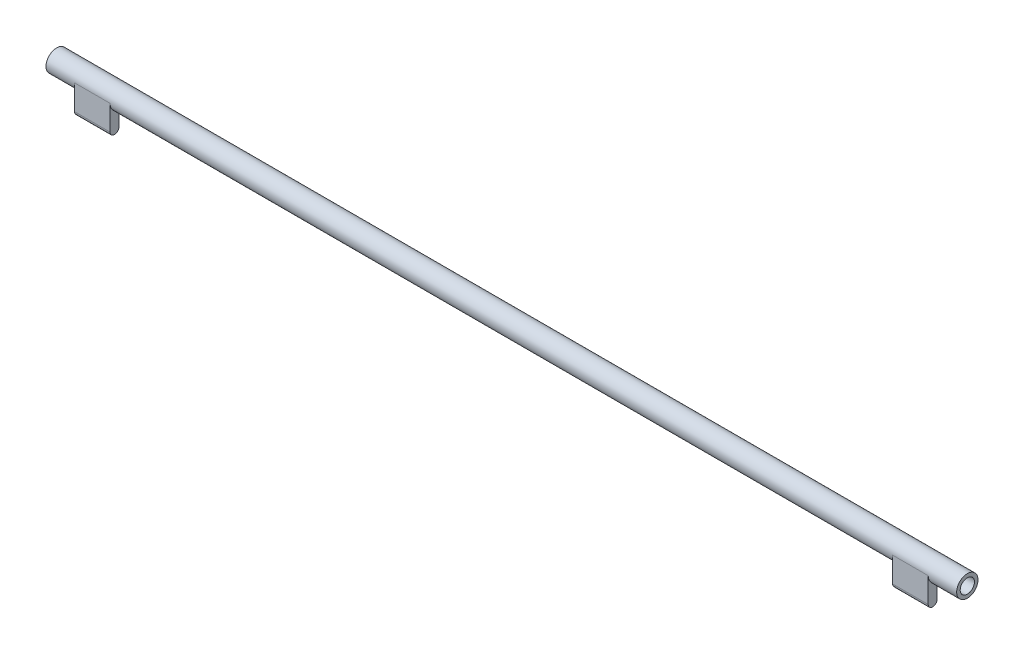
ISO-10303-21;
HEADER;
FILE_DESCRIPTION(('STEP AP214'),'2;1');
FILE_NAME('part.step','',(''),(''),'','','');
FILE_SCHEMA(('AUTOMOTIVE_DESIGN { 1 0 10303 214 1 1 1 1 }'));
ENDSEC;
DATA;
#1=APPLICATION_CONTEXT('core data for automotive mechanical design processes');
#2=APPLICATION_PROTOCOL_DEFINITION('international standard','automotive_design',2000,#1);
#3=PRODUCT_CONTEXT('',#1,'mechanical');
#4=PRODUCT('Part','Part','',(#3));
#5=PRODUCT_RELATED_PRODUCT_CATEGORY('part','',(#4));
#6=PRODUCT_DEFINITION_FORMATION('','',#4);
#7=PRODUCT_DEFINITION_CONTEXT('part definition',#1,'design');
#8=PRODUCT_DEFINITION('design','',#6,#7);
#9=PRODUCT_DEFINITION_SHAPE('','',#8);
#10=(LENGTH_UNIT() NAMED_UNIT(*) SI_UNIT(.MILLI.,.METRE.));
#11=(NAMED_UNIT(*) PLANE_ANGLE_UNIT() SI_UNIT($,.RADIAN.));
#12=(NAMED_UNIT(*) SI_UNIT($,.STERADIAN.) SOLID_ANGLE_UNIT());
#13=UNCERTAINTY_MEASURE_WITH_UNIT(LENGTH_MEASURE(1.E-05),#10,'distance_accuracy_value','');
#14=(GEOMETRIC_REPRESENTATION_CONTEXT(3) GLOBAL_UNCERTAINTY_ASSIGNED_CONTEXT((#13)) GLOBAL_UNIT_ASSIGNED_CONTEXT((#10,
#11,#12)) REPRESENTATION_CONTEXT('',''));
#15=CARTESIAN_POINT('',(0.,0.,0.));
#16=DIRECTION('',(0.,0.,1.));
#17=DIRECTION('',(1.,0.,0.));
#18=AXIS2_PLACEMENT_3D('',#15,#16,#17);
#19=CARTESIAN_POINT('',(128.,0.,0.));
#20=DIRECTION('',(1.,0.,0.));
#21=DIRECTION('',(0.,0.,-1.));
#22=AXIS2_PLACEMENT_3D('',#19,#20,#21);
#23=PLANE('',#22);
#24=CARTESIAN_POINT('',(128.,0.,0.));
#25=DIRECTION('',(1.,0.,0.));
#26=DIRECTION('',(0.,0.,-1.));
#27=AXIS2_PLACEMENT_3D('',#24,#25,#26);
#28=CIRCLE('',#27,3.);
#29=CARTESIAN_POINT('',(128.,0.,-3.));
#30=VERTEX_POINT('',#29);
#31=EDGE_CURVE('E11',#30,#30,#28,.T.);
#32=ORIENTED_EDGE('',*,*,#31,.T.);
#33=EDGE_LOOP('',(#32));
#34=FACE_BOUND('',#33,.T.);
#35=CARTESIAN_POINT('',(128.,0.,0.));
#36=DIRECTION('',(1.,0.,0.));
#37=DIRECTION('',(0.,0.,-1.));
#38=AXIS2_PLACEMENT_3D('',#35,#36,#37);
#39=CIRCLE('',#38,2.);
#40=CARTESIAN_POINT('',(128.,0.,-2.));
#41=VERTEX_POINT('',#40);
#42=EDGE_CURVE('E168',#41,#41,#39,.T.);
#43=ORIENTED_EDGE('',*,*,#42,.F.);
#44=EDGE_LOOP('',(#43));
#45=FACE_BOUND('',#44,.T.);
#46=ADVANCED_FACE('F36',(#34,#45),#23,.T.);
#47=CARTESIAN_POINT('',(-128.,0.,0.));
#48=DIRECTION('',(1.,0.,0.));
#49=DIRECTION('',(0.,0.,-1.));
#50=AXIS2_PLACEMENT_3D('',#47,#48,#49);
#51=PLANE('',#50);
#52=CARTESIAN_POINT('',(-128.,0.,0.));
#53=DIRECTION('',(1.,0.,0.));
#54=DIRECTION('',(0.,0.,-1.));
#55=AXIS2_PLACEMENT_3D('',#52,#53,#54);
#56=CIRCLE('',#55,3.);
#57=CARTESIAN_POINT('',(-128.,0.,-3.));
#58=VERTEX_POINT('',#57);
#59=EDGE_CURVE('E40',#58,#58,#56,.T.);
#60=ORIENTED_EDGE('',*,*,#59,.F.);
#61=EDGE_LOOP('',(#60));
#62=FACE_BOUND('',#61,.T.);
#63=CARTESIAN_POINT('',(-128.,0.,0.));
#64=DIRECTION('',(1.,0.,0.));
#65=DIRECTION('',(0.,0.,-1.));
#66=AXIS2_PLACEMENT_3D('',#63,#64,#65);
#67=CIRCLE('',#66,2.);
#68=CARTESIAN_POINT('',(-128.,0.,-2.));
#69=VERTEX_POINT('',#68);
#70=EDGE_CURVE('E167',#69,#69,#67,.T.);
#71=ORIENTED_EDGE('',*,*,#70,.T.);
#72=EDGE_LOOP('',(#71));
#73=FACE_BOUND('',#72,.T.);
#74=ADVANCED_FACE('F174',(#62,#73),#51,.F.);
#75=CARTESIAN_POINT('',(128.,0.,0.));
#76=DIRECTION('',(-1.,0.,0.));
#77=DIRECTION('',(0.,0.,1.));
#78=AXIS2_PLACEMENT_3D('',#75,#76,#77);
#79=CYLINDRICAL_SURFACE('',#78,3.);
#80=DIRECTION('',(1.,0.,0.));
#81=VECTOR('',#80,1.);
#82=CARTESIAN_POINT('',(-120.,-2.95803989154981,0.499999999999999));
#83=LINE('',#82,#81);
#84=CARTESIAN_POINT('',(-120.,-2.95803989154981,0.499999999999999));
#85=VERTEX_POINT('',#84);
#86=CARTESIAN_POINT('',(-110.,-2.95803989154981,0.499999999999999));
#87=VERTEX_POINT('',#86);
#88=EDGE_CURVE('E51',#85,#87,#83,.T.);
#89=ORIENTED_EDGE('',*,*,#88,.F.);
#90=CARTESIAN_POINT('',(-120.,0.,0.));
#91=DIRECTION('',(-1.,0.,0.));
#92=DIRECTION('',(0.,0.,-1.));
#93=AXIS2_PLACEMENT_3D('',#90,#91,#92);
#94=CIRCLE('',#93,3.);
#95=CARTESIAN_POINT('',(-120.,0.,3.));
#96=VERTEX_POINT('',#95);
#97=EDGE_CURVE('E55',#85,#96,#94,.T.);
#98=ORIENTED_EDGE('',*,*,#97,.T.);
#99=DIRECTION('',(1.,0.,0.));
#100=VECTOR('',#99,1.);
#101=CARTESIAN_POINT('',(-120.,0.,3.));
#102=LINE('',#101,#100);
#103=CARTESIAN_POINT('',(-110.,0.,3.));
#104=VERTEX_POINT('',#103);
#105=EDGE_CURVE('E121',#96,#104,#102,.T.);
#106=ORIENTED_EDGE('',*,*,#105,.T.);
#107=CARTESIAN_POINT('',(-110.,0.,0.));
#108=DIRECTION('',(-1.,0.,0.));
#109=DIRECTION('',(0.,0.,-1.));
#110=AXIS2_PLACEMENT_3D('',#107,#108,#109);
#111=CIRCLE('',#110,3.);
#112=EDGE_CURVE('E125',#87,#104,#111,.T.);
#113=ORIENTED_EDGE('',*,*,#112,.F.);
#114=EDGE_LOOP('',(#89,#98,#106,#113));
#115=FACE_BOUND('',#114,.T.);
#116=DIRECTION('',(-1.,0.,0.));
#117=VECTOR('',#116,1.);
#118=CARTESIAN_POINT('',(120.,0.,3.));
#119=LINE('',#118,#117);
#120=CARTESIAN_POINT('',(120.,0.,3.));
#121=VERTEX_POINT('',#120);
#122=CARTESIAN_POINT('',(110.,0.,3.));
#123=VERTEX_POINT('',#122);
#124=EDGE_CURVE('E164',#121,#123,#119,.T.);
#125=ORIENTED_EDGE('',*,*,#124,.F.);
#126=CARTESIAN_POINT('',(120.,0.,0.));
#127=DIRECTION('',(-1.,0.,0.));
#128=DIRECTION('',(0.,0.,-1.));
#129=AXIS2_PLACEMENT_3D('',#126,#127,#128);
#130=CIRCLE('',#129,3.);
#131=CARTESIAN_POINT('',(120.,-2.95803989154981,0.499999999999999));
#132=VERTEX_POINT('',#131);
#133=EDGE_CURVE('E138',#132,#121,#130,.T.);
#134=ORIENTED_EDGE('',*,*,#133,.F.);
#135=DIRECTION('',(-1.,0.,0.));
#136=VECTOR('',#135,1.);
#137=CARTESIAN_POINT('',(120.,-2.95803989154981,0.499999999999999));
#138=LINE('',#137,#136);
#139=CARTESIAN_POINT('',(110.,-2.95803989154981,0.499999999999999));
#140=VERTEX_POINT('',#139);
#141=EDGE_CURVE('E149',#132,#140,#138,.T.);
#142=ORIENTED_EDGE('',*,*,#141,.T.);
#143=CARTESIAN_POINT('',(110.,0.,0.));
#144=DIRECTION('',(-1.,0.,0.));
#145=DIRECTION('',(0.,0.,-1.));
#146=AXIS2_PLACEMENT_3D('',#143,#144,#145);
#147=CIRCLE('',#146,3.);
#148=EDGE_CURVE('E137',#140,#123,#147,.T.);
#149=ORIENTED_EDGE('',*,*,#148,.T.);
#150=EDGE_LOOP('',(#125,#134,#142,#149));
#151=FACE_BOUND('',#150,.T.);
#152=ORIENTED_EDGE('',*,*,#31,.F.);
#153=EDGE_LOOP('',(#152));
#154=FACE_BOUND('',#153,.T.);
#155=ORIENTED_EDGE('',*,*,#59,.T.);
#156=EDGE_LOOP('',(#155));
#157=FACE_BOUND('',#156,.T.);
#158=ADVANCED_FACE('F38',(#115,#151,#154,#157),#79,.T.);
#159=CARTESIAN_POINT('',(128.,0.,0.));
#160=DIRECTION('',(-1.,0.,0.));
#161=DIRECTION('',(0.,0.,1.));
#162=AXIS2_PLACEMENT_3D('',#159,#160,#161);
#163=CYLINDRICAL_SURFACE('',#162,2.);
#164=ORIENTED_EDGE('',*,*,#42,.T.);
#165=EDGE_LOOP('',(#164));
#166=FACE_BOUND('',#165,.T.);
#167=ORIENTED_EDGE('',*,*,#70,.F.);
#168=EDGE_LOOP('',(#167));
#169=FACE_BOUND('',#168,.T.);
#170=ADVANCED_FACE('F176',(#166,#169),#163,.F.);
#171=CARTESIAN_POINT('',(120.,0.,3.));
#172=DIRECTION('',(0.,0.,-1.));
#173=DIRECTION('',(0.,1.,0.));
#174=AXIS2_PLACEMENT_3D('',#171,#172,#173);
#175=PLANE('',#174);
#176=DIRECTION('',(0.,-1.,0.));
#177=VECTOR('',#176,1.);
#178=CARTESIAN_POINT('',(110.,0.,3.));
#179=LINE('',#178,#177);
#180=CARTESIAN_POINT('',(110.,-7.,3.));
#181=VERTEX_POINT('',#180);
#182=EDGE_CURVE('E151',#123,#181,#179,.T.);
#183=ORIENTED_EDGE('',*,*,#182,.T.);
#184=DIRECTION('',(-1.,0.,0.));
#185=VECTOR('',#184,1.);
#186=CARTESIAN_POINT('',(120.,-7.,3.));
#187=LINE('',#186,#185);
#188=CARTESIAN_POINT('',(120.,-7.,3.));
#189=VERTEX_POINT('',#188);
#190=EDGE_CURVE('E161',#189,#181,#187,.T.);
#191=ORIENTED_EDGE('',*,*,#190,.F.);
#192=DIRECTION('',(0.,-1.,0.));
#193=VECTOR('',#192,1.);
#194=CARTESIAN_POINT('',(120.,0.,3.));
#195=LINE('',#194,#193);
#196=EDGE_CURVE('E141',#121,#189,#195,.T.);
#197=ORIENTED_EDGE('',*,*,#196,.F.);
#198=ORIENTED_EDGE('',*,*,#124,.T.);
#199=EDGE_LOOP('',(#183,#191,#197,#198));
#200=FACE_BOUND('',#199,.T.);
#201=ADVANCED_FACE('F178',(#200),#175,.F.);
#202=CARTESIAN_POINT('',(120.,-7.,1.75));
#203=DIRECTION('',(-1.,0.,0.));
#204=DIRECTION('',(0.,0.,1.));
#205=AXIS2_PLACEMENT_3D('',#202,#203,#204);
#206=CYLINDRICAL_SURFACE('',#205,1.25);
#207=CARTESIAN_POINT('',(110.,-7.,1.75));
#208=DIRECTION('',(1.,0.,0.));
#209=DIRECTION('',(0.,0.,-1.));
#210=AXIS2_PLACEMENT_3D('',#207,#208,#209);
#211=CIRCLE('',#210,1.25);
#212=CARTESIAN_POINT('',(110.,-7.,0.5));
#213=VERTEX_POINT('',#212);
#214=EDGE_CURVE('E153',#181,#213,#211,.T.);
#215=ORIENTED_EDGE('',*,*,#214,.T.);
#216=DIRECTION('',(-1.,0.,0.));
#217=VECTOR('',#216,1.);
#218=CARTESIAN_POINT('',(120.,-7.,0.5));
#219=LINE('',#218,#217);
#220=CARTESIAN_POINT('',(120.,-7.,0.5));
#221=VERTEX_POINT('',#220);
#222=EDGE_CURVE('E158',#221,#213,#219,.T.);
#223=ORIENTED_EDGE('',*,*,#222,.F.);
#224=CARTESIAN_POINT('',(120.,-7.,1.75));
#225=DIRECTION('',(1.,0.,0.));
#226=DIRECTION('',(0.,0.,-1.));
#227=AXIS2_PLACEMENT_3D('',#224,#225,#226);
#228=CIRCLE('',#227,1.25);
#229=EDGE_CURVE('E144',#189,#221,#228,.T.);
#230=ORIENTED_EDGE('',*,*,#229,.F.);
#231=ORIENTED_EDGE('',*,*,#190,.T.);
#232=EDGE_LOOP('',(#215,#223,#230,#231));
#233=FACE_BOUND('',#232,.T.);
#234=ADVANCED_FACE('F185',(#233),#206,.T.);
#235=CARTESIAN_POINT('',(120.,-2.95803989154981,0.499999999999999));
#236=DIRECTION('',(0.,0.,1.));
#237=DIRECTION('',(0.,-1.,0.));
#238=AXIS2_PLACEMENT_3D('',#235,#236,#237);
#239=PLANE('',#238);
#240=DIRECTION('',(0.,1.,0.));
#241=VECTOR('',#240,1.);
#242=CARTESIAN_POINT('',(110.,-2.95803989154981,0.499999999999999));
#243=LINE('',#242,#241);
#244=EDGE_CURVE('E142',#213,#140,#243,.T.);
#245=ORIENTED_EDGE('',*,*,#244,.T.);
#246=ORIENTED_EDGE('',*,*,#141,.F.);
#247=DIRECTION('',(0.,1.,0.));
#248=VECTOR('',#247,1.);
#249=CARTESIAN_POINT('',(120.,-2.95803989154981,0.499999999999999));
#250=LINE('',#249,#248);
#251=EDGE_CURVE('E146',#221,#132,#250,.T.);
#252=ORIENTED_EDGE('',*,*,#251,.F.);
#253=ORIENTED_EDGE('',*,*,#222,.T.);
#254=EDGE_LOOP('',(#245,#246,#252,#253));
#255=FACE_BOUND('',#254,.T.);
#256=ADVANCED_FACE('F267',(#255),#239,.F.);
#257=CARTESIAN_POINT('',(120.,0.,0.));
#258=DIRECTION('',(1.,0.,0.));
#259=DIRECTION('',(0.,0.,-1.));
#260=AXIS2_PLACEMENT_3D('',#257,#258,#259);
#261=PLANE('',#260);
#262=ORIENTED_EDGE('',*,*,#133,.T.);
#263=ORIENTED_EDGE('',*,*,#196,.T.);
#264=ORIENTED_EDGE('',*,*,#229,.T.);
#265=ORIENTED_EDGE('',*,*,#251,.T.);
#266=EDGE_LOOP('',(#262,#263,#264,#265));
#267=FACE_BOUND('',#266,.T.);
#268=ADVANCED_FACE('F264',(#267),#261,.T.);
#269=CARTESIAN_POINT('',(110.,0.,0.));
#270=DIRECTION('',(1.,0.,0.));
#271=DIRECTION('',(0.,0.,-1.));
#272=AXIS2_PLACEMENT_3D('',#269,#270,#271);
#273=PLANE('',#272);
#274=ORIENTED_EDGE('',*,*,#148,.F.);
#275=ORIENTED_EDGE('',*,*,#244,.F.);
#276=ORIENTED_EDGE('',*,*,#214,.F.);
#277=ORIENTED_EDGE('',*,*,#182,.F.);
#278=EDGE_LOOP('',(#274,#275,#276,#277));
#279=FACE_BOUND('',#278,.T.);
#280=ADVANCED_FACE('F215',(#279),#273,.F.);
#281=CARTESIAN_POINT('',(-120.,-2.95803989154981,0.499999999999999));
#282=DIRECTION('',(0.,0.,-1.));
#283=DIRECTION('',(0.,1.,0.));
#284=AXIS2_PLACEMENT_3D('',#281,#282,#283);
#285=PLANE('',#284);
#286=DIRECTION('',(0.,1.,0.));
#287=VECTOR('',#286,1.);
#288=CARTESIAN_POINT('',(-110.,-2.95803989154981,0.499999999999999));
#289=LINE('',#288,#287);
#290=CARTESIAN_POINT('',(-110.,-7.,0.5));
#291=VERTEX_POINT('',#290);
#292=EDGE_CURVE('E104',#291,#87,#289,.T.);
#293=ORIENTED_EDGE('',*,*,#292,.F.);
#294=DIRECTION('',(1.,0.,0.));
#295=VECTOR('',#294,1.);
#296=CARTESIAN_POINT('',(-120.,-7.,0.5));
#297=LINE('',#296,#295);
#298=CARTESIAN_POINT('',(-120.,-7.,0.5));
#299=VERTEX_POINT('',#298);
#300=EDGE_CURVE('E99',#299,#291,#297,.T.);
#301=ORIENTED_EDGE('',*,*,#300,.F.);
#302=DIRECTION('',(0.,1.,0.));
#303=VECTOR('',#302,1.);
#304=CARTESIAN_POINT('',(-120.,-2.95803989154981,0.499999999999999));
#305=LINE('',#304,#303);
#306=EDGE_CURVE('E102',#299,#85,#305,.T.);
#307=ORIENTED_EDGE('',*,*,#306,.T.);
#308=ORIENTED_EDGE('',*,*,#88,.T.);
#309=EDGE_LOOP('',(#293,#301,#307,#308));
#310=FACE_BOUND('',#309,.T.);
#311=ADVANCED_FACE('F101',(#310),#285,.T.);
#312=CARTESIAN_POINT('',(-120.,-7.,1.75));
#313=DIRECTION('',(1.,0.,0.));
#314=DIRECTION('',(0.,0.,-1.));
#315=AXIS2_PLACEMENT_3D('',#312,#313,#314);
#316=CYLINDRICAL_SURFACE('',#315,1.25);
#317=CARTESIAN_POINT('',(-110.,-7.,1.75));
#318=DIRECTION('',(1.,0.,0.));
#319=DIRECTION('',(0.,0.,-1.));
#320=AXIS2_PLACEMENT_3D('',#317,#318,#319);
#321=CIRCLE('',#320,1.25);
#322=CARTESIAN_POINT('',(-110.,-7.,3.));
#323=VERTEX_POINT('',#322);
#324=EDGE_CURVE('E129',#323,#291,#321,.T.);
#325=ORIENTED_EDGE('',*,*,#324,.F.);
#326=DIRECTION('',(1.,0.,0.));
#327=VECTOR('',#326,1.);
#328=CARTESIAN_POINT('',(-120.,-7.,3.));
#329=LINE('',#328,#327);
#330=CARTESIAN_POINT('',(-120.,-7.,3.));
#331=VERTEX_POINT('',#330);
#332=EDGE_CURVE('E109',#331,#323,#329,.T.);
#333=ORIENTED_EDGE('',*,*,#332,.F.);
#334=CARTESIAN_POINT('',(-120.,-7.,1.75));
#335=DIRECTION('',(1.,0.,0.));
#336=DIRECTION('',(0.,0.,-1.));
#337=AXIS2_PLACEMENT_3D('',#334,#335,#336);
#338=CIRCLE('',#337,1.25);
#339=EDGE_CURVE('E115',#331,#299,#338,.T.);
#340=ORIENTED_EDGE('',*,*,#339,.T.);
#341=ORIENTED_EDGE('',*,*,#300,.T.);
#342=EDGE_LOOP('',(#325,#333,#340,#341));
#343=FACE_BOUND('',#342,.T.);
#344=ADVANCED_FACE('F118',(#343),#316,.T.);
#345=CARTESIAN_POINT('',(-120.,0.,3.));
#346=DIRECTION('',(0.,0.,1.));
#347=DIRECTION('',(0.,-1.,0.));
#348=AXIS2_PLACEMENT_3D('',#345,#346,#347);
#349=PLANE('',#348);
#350=DIRECTION('',(0.,-1.,0.));
#351=VECTOR('',#350,1.);
#352=CARTESIAN_POINT('',(-110.,0.,3.));
#353=LINE('',#352,#351);
#354=EDGE_CURVE('E131',#104,#323,#353,.T.);
#355=ORIENTED_EDGE('',*,*,#354,.F.);
#356=ORIENTED_EDGE('',*,*,#105,.F.);
#357=DIRECTION('',(0.,-1.,0.));
#358=VECTOR('',#357,1.);
#359=CARTESIAN_POINT('',(-120.,0.,3.));
#360=LINE('',#359,#358);
#361=EDGE_CURVE('E119',#96,#331,#360,.T.);
#362=ORIENTED_EDGE('',*,*,#361,.T.);
#363=ORIENTED_EDGE('',*,*,#332,.T.);
#364=EDGE_LOOP('',(#355,#356,#362,#363));
#365=FACE_BOUND('',#364,.T.);
#366=ADVANCED_FACE('F232',(#365),#349,.T.);
#367=CARTESIAN_POINT('',(-120.,0.,0.));
#368=DIRECTION('',(-1.,0.,0.));
#369=DIRECTION('',(0.,0.,-1.));
#370=AXIS2_PLACEMENT_3D('',#367,#368,#369);
#371=PLANE('',#370);
#372=ORIENTED_EDGE('',*,*,#97,.F.);
#373=ORIENTED_EDGE('',*,*,#306,.F.);
#374=ORIENTED_EDGE('',*,*,#339,.F.);
#375=ORIENTED_EDGE('',*,*,#361,.F.);
#376=EDGE_LOOP('',(#372,#373,#374,#375));
#377=FACE_BOUND('',#376,.T.);
#378=ADVANCED_FACE('F113',(#377),#371,.T.);
#379=CARTESIAN_POINT('',(-110.,0.,0.));
#380=DIRECTION('',(-1.,0.,0.));
#381=DIRECTION('',(0.,0.,-1.));
#382=AXIS2_PLACEMENT_3D('',#379,#380,#381);
#383=PLANE('',#382);
#384=ORIENTED_EDGE('',*,*,#112,.T.);
#385=ORIENTED_EDGE('',*,*,#354,.T.);
#386=ORIENTED_EDGE('',*,*,#324,.T.);
#387=ORIENTED_EDGE('',*,*,#292,.T.);
#388=EDGE_LOOP('',(#384,#385,#386,#387));
#389=FACE_BOUND('',#388,.T.);
#390=ADVANCED_FACE('F250',(#389),#383,.F.);
#391=CLOSED_SHELL('',(#46,#74,#158,#170,#201,#234,#256,#268,#280,#311,#344,#366,#378,#390));
#392=MANIFOLD_SOLID_BREP('B2',#391);
#393=ADVANCED_BREP_SHAPE_REPRESENTATION('',(#18,#392),#14);
#394=SHAPE_DEFINITION_REPRESENTATION(#9,#393);
ENDSEC;
END-ISO-10303-21;
